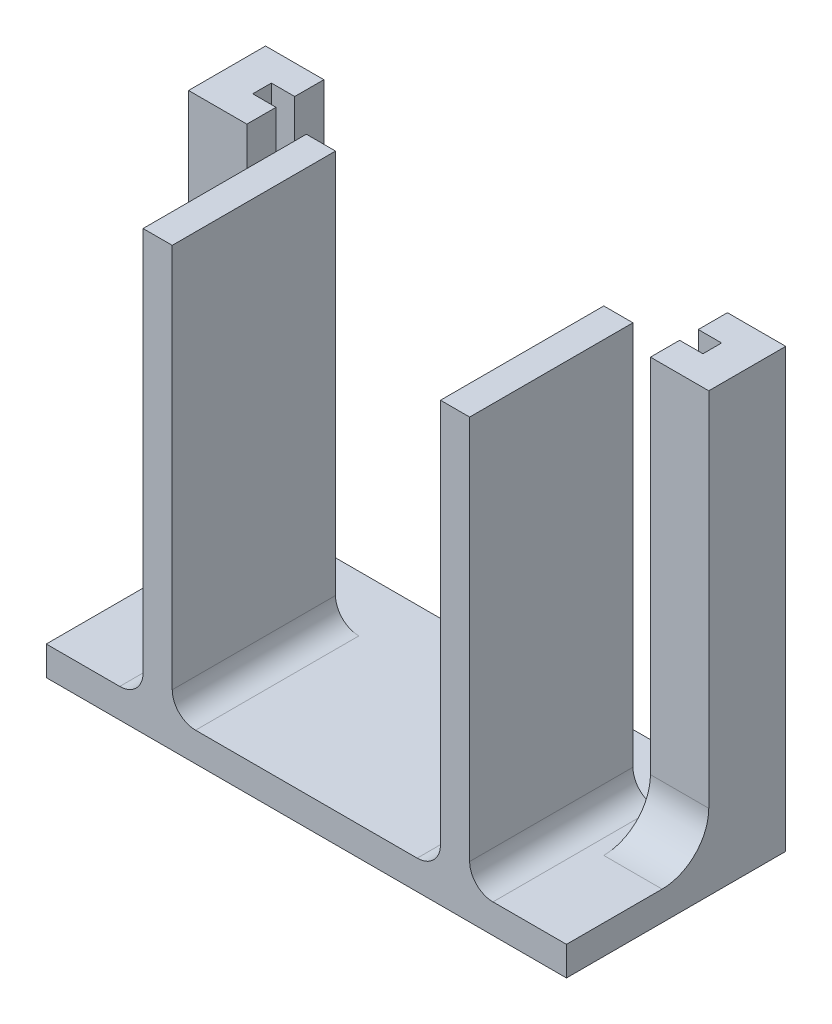
ISO-10303-21;
HEADER;
FILE_DESCRIPTION(('STEP AP214'),'2;1');
FILE_NAME('part.step','',(''),(''),'','','');
FILE_SCHEMA(('AUTOMOTIVE_DESIGN { 1 0 10303 214 1 1 1 1 }'));
ENDSEC;
DATA;
#1=APPLICATION_CONTEXT('core data for automotive mechanical design processes');
#2=APPLICATION_PROTOCOL_DEFINITION('international standard','automotive_design',2000,#1);
#3=PRODUCT_CONTEXT('',#1,'mechanical');
#4=PRODUCT('Part','Part','',(#3));
#5=PRODUCT_RELATED_PRODUCT_CATEGORY('part','',(#4));
#6=PRODUCT_DEFINITION_FORMATION('','',#4);
#7=PRODUCT_DEFINITION_CONTEXT('part definition',#1,'design');
#8=PRODUCT_DEFINITION('design','',#6,#7);
#9=PRODUCT_DEFINITION_SHAPE('','',#8);
#10=(LENGTH_UNIT() NAMED_UNIT(*) SI_UNIT(.MILLI.,.METRE.));
#11=(NAMED_UNIT(*) PLANE_ANGLE_UNIT() SI_UNIT($,.RADIAN.));
#12=(NAMED_UNIT(*) SI_UNIT($,.STERADIAN.) SOLID_ANGLE_UNIT());
#13=UNCERTAINTY_MEASURE_WITH_UNIT(LENGTH_MEASURE(1.E-05),#10,'distance_accuracy_value','');
#14=(GEOMETRIC_REPRESENTATION_CONTEXT(3) GLOBAL_UNCERTAINTY_ASSIGNED_CONTEXT((#13)) GLOBAL_UNIT_ASSIGNED_CONTEXT((#10,
#11,#12)) REPRESENTATION_CONTEXT('',''));
#15=CARTESIAN_POINT('',(0.,0.,0.));
#16=DIRECTION('',(0.,0.,1.));
#17=DIRECTION('',(1.,0.,0.));
#18=AXIS2_PLACEMENT_3D('',#15,#16,#17);
#19=CARTESIAN_POINT('',(-19.3,16.,1.3));
#20=DIRECTION('',(-1.,0.,0.));
#21=DIRECTION('',(0.,0.,1.));
#22=AXIS2_PLACEMENT_3D('',#19,#20,#21);
#23=PLANE('',#22);
#24=DIRECTION('',(0.,0.,-1.));
#25=VECTOR('',#24,1.);
#26=CARTESIAN_POINT('',(-19.3,-19.,1.3));
#27=LINE('',#26,#25);
#28=CARTESIAN_POINT('',(-19.3,-19.,1.3));
#29=VERTEX_POINT('',#28);
#30=CARTESIAN_POINT('',(-19.3,-19.,-0.3));
#31=VERTEX_POINT('',#30);
#32=EDGE_CURVE('E377',#29,#31,#27,.T.);
#33=ORIENTED_EDGE('',*,*,#32,.T.);
#34=DIRECTION('',(0.,-1.,0.));
#35=VECTOR('',#34,1.);
#36=CARTESIAN_POINT('',(-19.3,16.,-0.3));
#37=LINE('',#36,#35);
#38=CARTESIAN_POINT('',(-19.3,16.,-0.3));
#39=VERTEX_POINT('',#38);
#40=EDGE_CURVE('E434',#39,#31,#37,.T.);
#41=ORIENTED_EDGE('',*,*,#40,.F.);
#42=DIRECTION('',(0.,0.,-1.));
#43=VECTOR('',#42,1.);
#44=CARTESIAN_POINT('',(-19.3,16.,1.3));
#45=LINE('',#44,#43);
#46=CARTESIAN_POINT('',(-19.3,16.,1.3));
#47=VERTEX_POINT('',#46);
#48=EDGE_CURVE('E384',#47,#39,#45,.T.);
#49=ORIENTED_EDGE('',*,*,#48,.F.);
#50=DIRECTION('',(0.,-1.,0.));
#51=VECTOR('',#50,1.);
#52=CARTESIAN_POINT('',(-19.3,16.,1.3));
#53=LINE('',#52,#51);
#54=EDGE_CURVE('E401',#47,#29,#53,.T.);
#55=ORIENTED_EDGE('',*,*,#54,.T.);
#56=EDGE_LOOP('',(#33,#41,#49,#55));
#57=FACE_BOUND('',#56,.T.);
#58=ADVANCED_FACE('F39',(#57),#23,.F.);
#59=CARTESIAN_POINT('',(-19.3,16.,-0.3));
#60=DIRECTION('',(0.,0.,-1.));
#61=DIRECTION('',(-1.,0.,0.));
#62=AXIS2_PLACEMENT_3D('',#59,#60,#61);
#63=PLANE('',#62);
#64=DIRECTION('',(1.,0.,0.));
#65=VECTOR('',#64,1.);
#66=CARTESIAN_POINT('',(-19.3,-19.,-0.3));
#67=LINE('',#66,#65);
#68=CARTESIAN_POINT('',(-17.3,-19.,-0.3));
#69=VERTEX_POINT('',#68);
#70=EDGE_CURVE('E409',#31,#69,#67,.T.);
#71=ORIENTED_EDGE('',*,*,#70,.T.);
#72=DIRECTION('',(0.,-1.,0.));
#73=VECTOR('',#72,1.);
#74=CARTESIAN_POINT('',(-17.3,16.,-0.3));
#75=LINE('',#74,#73);
#76=CARTESIAN_POINT('',(-17.3,16.,-0.3));
#77=VERTEX_POINT('',#76);
#78=EDGE_CURVE('E435',#77,#69,#75,.T.);
#79=ORIENTED_EDGE('',*,*,#78,.F.);
#80=DIRECTION('',(1.,0.,0.));
#81=VECTOR('',#80,1.);
#82=CARTESIAN_POINT('',(-19.3,16.,-0.3));
#83=LINE('',#82,#81);
#84=EDGE_CURVE('E389',#39,#77,#83,.T.);
#85=ORIENTED_EDGE('',*,*,#84,.F.);
#86=ORIENTED_EDGE('',*,*,#40,.T.);
#87=EDGE_LOOP('',(#71,#79,#85,#86));
#88=FACE_BOUND('',#87,.T.);
#89=ADVANCED_FACE('F581',(#88),#63,.F.);
#90=CARTESIAN_POINT('',(-17.3,16.,-0.3));
#91=DIRECTION('',(-1.,0.,0.));
#92=DIRECTION('',(0.,0.,1.));
#93=AXIS2_PLACEMENT_3D('',#90,#91,#92);
#94=PLANE('',#93);
#95=DIRECTION('',(0.,0.,-1.));
#96=VECTOR('',#95,1.);
#97=CARTESIAN_POINT('',(-17.3,-19.,-0.3));
#98=LINE('',#97,#96);
#99=CARTESIAN_POINT('',(-17.3,-19.,-2.8));
#100=VERTEX_POINT('',#99);
#101=EDGE_CURVE('E408',#69,#100,#98,.T.);
#102=ORIENTED_EDGE('',*,*,#101,.T.);
#103=DIRECTION('',(0.,-1.,0.));
#104=VECTOR('',#103,1.);
#105=CARTESIAN_POINT('',(-17.3,16.,-2.8));
#106=LINE('',#105,#104);
#107=CARTESIAN_POINT('',(-17.3,16.,-2.8));
#108=VERTEX_POINT('',#107);
#109=EDGE_CURVE('E427',#108,#100,#106,.T.);
#110=ORIENTED_EDGE('',*,*,#109,.F.);
#111=DIRECTION('',(0.,0.,-1.));
#112=VECTOR('',#111,1.);
#113=CARTESIAN_POINT('',(-17.3,16.,-0.3));
#114=LINE('',#113,#112);
#115=EDGE_CURVE('E394',#77,#108,#114,.T.);
#116=ORIENTED_EDGE('',*,*,#115,.F.);
#117=ORIENTED_EDGE('',*,*,#78,.T.);
#118=EDGE_LOOP('',(#102,#110,#116,#117));
#119=FACE_BOUND('',#118,.T.);
#120=ADVANCED_FACE('F577',(#119),#94,.F.);
#121=CARTESIAN_POINT('',(-17.3,16.,-2.8));
#122=DIRECTION('',(0.,0.,1.));
#123=DIRECTION('',(1.,0.,0.));
#124=AXIS2_PLACEMENT_3D('',#121,#122,#123);
#125=PLANE('',#124);
#126=ORIENTED_EDGE('',*,*,#109,.T.);
#127=DIRECTION('',(-1.,0.,0.));
#128=VECTOR('',#127,1.);
#129=CARTESIAN_POINT('',(-22.3,-19.,-2.8));
#130=LINE('',#129,#128);
#131=CARTESIAN_POINT('',(17.3,-19.,-2.8));
#132=VERTEX_POINT('',#131);
#133=EDGE_CURVE('E356',#132,#100,#130,.T.);
#134=ORIENTED_EDGE('',*,*,#133,.F.);
#135=DIRECTION('',(0.,-1.,0.));
#136=VECTOR('',#135,1.);
#137=CARTESIAN_POINT('',(17.3,16.,-2.8));
#138=LINE('',#137,#136);
#139=CARTESIAN_POINT('',(17.3,16.,-2.8));
#140=VERTEX_POINT('',#139);
#141=EDGE_CURVE('E315',#140,#132,#138,.T.);
#142=ORIENTED_EDGE('',*,*,#141,.F.);
#143=DIRECTION('',(-1.,0.,0.));
#144=VECTOR('',#143,1.);
#145=CARTESIAN_POINT('',(17.3,16.,-2.8));
#146=LINE('',#145,#144);
#147=CARTESIAN_POINT('',(22.3,16.,-2.8));
#148=VERTEX_POINT('',#147);
#149=EDGE_CURVE('E341',#148,#140,#146,.T.);
#150=ORIENTED_EDGE('',*,*,#149,.F.);
#151=DIRECTION('',(0.,1.,0.));
#152=VECTOR('',#151,1.);
#153=CARTESIAN_POINT('',(22.3,-21.5,-2.8));
#154=LINE('',#153,#152);
#155=CARTESIAN_POINT('',(22.3,-21.5,-2.8));
#156=VERTEX_POINT('',#155);
#157=EDGE_CURVE('E380',#156,#148,#154,.T.);
#158=ORIENTED_EDGE('',*,*,#157,.F.);
#159=DIRECTION('',(-1.,0.,0.));
#160=VECTOR('',#159,1.);
#161=CARTESIAN_POINT('',(-22.3,-21.5,-2.8));
#162=LINE('',#161,#160);
#163=CARTESIAN_POINT('',(-22.3,-21.5,-2.8));
#164=VERTEX_POINT('',#163);
#165=EDGE_CURVE('E361',#156,#164,#162,.T.);
#166=ORIENTED_EDGE('',*,*,#165,.T.);
#167=DIRECTION('',(0.,-1.,0.));
#168=VECTOR('',#167,1.);
#169=CARTESIAN_POINT('',(-22.3,16.,-2.8));
#170=LINE('',#169,#168);
#171=CARTESIAN_POINT('',(-22.3,16.,-2.8));
#172=VERTEX_POINT('',#171);
#173=EDGE_CURVE('E430',#172,#164,#170,.T.);
#174=ORIENTED_EDGE('',*,*,#173,.F.);
#175=DIRECTION('',(-1.,0.,0.));
#176=VECTOR('',#175,1.);
#177=CARTESIAN_POINT('',(-17.3,16.,-2.8));
#178=LINE('',#177,#176);
#179=EDGE_CURVE('E395',#108,#172,#178,.T.);
#180=ORIENTED_EDGE('',*,*,#179,.F.);
#181=EDGE_LOOP('',(#126,#134,#142,#150,#158,#166,#174,#180));
#182=FACE_BOUND('',#181,.T.);
#183=ADVANCED_FACE('F571',(#182),#125,.F.);
#184=CARTESIAN_POINT('',(-22.3,16.,-2.8));
#185=DIRECTION('',(1.,0.,0.));
#186=DIRECTION('',(0.,0.,-1.));
#187=AXIS2_PLACEMENT_3D('',#184,#185,#186);
#188=PLANE('',#187);
#189=ORIENTED_EDGE('',*,*,#173,.T.);
#190=DIRECTION('',(0.,0.,1.));
#191=VECTOR('',#190,1.);
#192=CARTESIAN_POINT('',(-22.3,-21.5,-2.8));
#193=LINE('',#192,#191);
#194=CARTESIAN_POINT('',(-22.3,-21.5,16.));
#195=VERTEX_POINT('',#194);
#196=EDGE_CURVE('E355',#164,#195,#193,.T.);
#197=ORIENTED_EDGE('',*,*,#196,.T.);
#198=DIRECTION('',(0.,1.,0.));
#199=VECTOR('',#198,1.);
#200=CARTESIAN_POINT('',(-22.3,-21.5,16.));
#201=LINE('',#200,#199);
#202=CARTESIAN_POINT('',(-22.3,-19.,16.));
#203=VERTEX_POINT('',#202);
#204=EDGE_CURVE('E368',#195,#203,#201,.T.);
#205=ORIENTED_EDGE('',*,*,#204,.T.);
#206=DIRECTION('',(0.,0.,1.));
#207=VECTOR('',#206,1.);
#208=CARTESIAN_POINT('',(-22.3,-19.,-2.8));
#209=LINE('',#208,#207);
#210=CARTESIAN_POINT('',(-22.3,-19.,7.8));
#211=VERTEX_POINT('',#210);
#212=EDGE_CURVE('E339',#211,#203,#209,.T.);
#213=ORIENTED_EDGE('',*,*,#212,.F.);
#214=CARTESIAN_POINT('',(-22.3,-15.,7.8));
#215=DIRECTION('',(1.,0.,0.));
#216=DIRECTION('',(0.,0.,-1.));
#217=AXIS2_PLACEMENT_3D('',#214,#215,#216);
#218=CIRCLE('',#217,4.);
#219=CARTESIAN_POINT('',(-22.3,-15.,3.8));
#220=VERTEX_POINT('',#219);
#221=EDGE_CURVE('E11',#211,#220,#218,.T.);
#222=ORIENTED_EDGE('',*,*,#221,.T.);
#223=DIRECTION('',(0.,-1.,0.));
#224=VECTOR('',#223,1.);
#225=CARTESIAN_POINT('',(-22.3,16.,3.8));
#226=LINE('',#225,#224);
#227=CARTESIAN_POINT('',(-22.3,16.,3.8));
#228=VERTEX_POINT('',#227);
#229=EDGE_CURVE('E422',#228,#220,#226,.T.);
#230=ORIENTED_EDGE('',*,*,#229,.F.);
#231=DIRECTION('',(0.,0.,1.));
#232=VECTOR('',#231,1.);
#233=CARTESIAN_POINT('',(-22.3,16.,-2.8));
#234=LINE('',#233,#232);
#235=EDGE_CURVE('E392',#172,#228,#234,.T.);
#236=ORIENTED_EDGE('',*,*,#235,.F.);
#237=EDGE_LOOP('',(#189,#197,#205,#213,#222,#230,#236));
#238=FACE_BOUND('',#237,.T.);
#239=ADVANCED_FACE('F494',(#238),#188,.F.);
#240=CARTESIAN_POINT('',(-22.3,16.,3.8));
#241=DIRECTION('',(0.,0.,-1.));
#242=DIRECTION('',(-1.,0.,0.));
#243=AXIS2_PLACEMENT_3D('',#240,#241,#242);
#244=PLANE('',#243);
#245=ORIENTED_EDGE('',*,*,#229,.T.);
#246=DIRECTION('',(1.,0.,0.));
#247=VECTOR('',#246,1.);
#248=CARTESIAN_POINT('',(-22.3,-15.,3.8));
#249=LINE('',#248,#247);
#250=CARTESIAN_POINT('',(-17.3,-15.,3.8));
#251=VERTEX_POINT('',#250);
#252=EDGE_CURVE('E483',#220,#251,#249,.T.);
#253=ORIENTED_EDGE('',*,*,#252,.T.);
#254=DIRECTION('',(0.,-1.,0.));
#255=VECTOR('',#254,1.);
#256=CARTESIAN_POINT('',(-17.3,16.,3.8));
#257=LINE('',#256,#255);
#258=CARTESIAN_POINT('',(-17.3,16.,3.8));
#259=VERTEX_POINT('',#258);
#260=EDGE_CURVE('E425',#259,#251,#257,.T.);
#261=ORIENTED_EDGE('',*,*,#260,.F.);
#262=DIRECTION('',(1.,0.,0.));
#263=VECTOR('',#262,1.);
#264=CARTESIAN_POINT('',(-22.3,16.,3.8));
#265=LINE('',#264,#263);
#266=EDGE_CURVE('E396',#228,#259,#265,.T.);
#267=ORIENTED_EDGE('',*,*,#266,.F.);
#268=EDGE_LOOP('',(#245,#253,#261,#267));
#269=FACE_BOUND('',#268,.T.);
#270=ADVANCED_FACE('F596',(#269),#244,.F.);
#271=CARTESIAN_POINT('',(-17.3,16.,3.8));
#272=DIRECTION('',(-1.,0.,0.));
#273=DIRECTION('',(0.,0.,1.));
#274=AXIS2_PLACEMENT_3D('',#271,#272,#273);
#275=PLANE('',#274);
#276=DIRECTION('',(0.,0.,-1.));
#277=VECTOR('',#276,1.);
#278=CARTESIAN_POINT('',(-17.3,-19.,3.8));
#279=LINE('',#278,#277);
#280=CARTESIAN_POINT('',(-17.3,-19.,7.8));
#281=VERTEX_POINT('',#280);
#282=CARTESIAN_POINT('',(-17.3,-19.,1.3));
#283=VERTEX_POINT('',#282);
#284=EDGE_CURVE('E411',#281,#283,#279,.T.);
#285=ORIENTED_EDGE('',*,*,#284,.T.);
#286=DIRECTION('',(0.,-1.,0.));
#287=VECTOR('',#286,1.);
#288=CARTESIAN_POINT('',(-17.3,16.,1.3));
#289=LINE('',#288,#287);
#290=CARTESIAN_POINT('',(-17.3,16.,1.3));
#291=VERTEX_POINT('',#290);
#292=EDGE_CURVE('E420',#291,#283,#289,.T.);
#293=ORIENTED_EDGE('',*,*,#292,.F.);
#294=DIRECTION('',(0.,0.,-1.));
#295=VECTOR('',#294,1.);
#296=CARTESIAN_POINT('',(-17.3,16.,3.8));
#297=LINE('',#296,#295);
#298=EDGE_CURVE('E398',#259,#291,#297,.T.);
#299=ORIENTED_EDGE('',*,*,#298,.F.);
#300=ORIENTED_EDGE('',*,*,#260,.T.);
#301=CARTESIAN_POINT('',(-17.3,-15.,7.8));
#302=DIRECTION('',(-1.,0.,0.));
#303=DIRECTION('',(0.,0.,1.));
#304=AXIS2_PLACEMENT_3D('',#301,#302,#303);
#305=CIRCLE('',#304,4.);
#306=EDGE_CURVE('E50',#251,#281,#305,.T.);
#307=ORIENTED_EDGE('',*,*,#306,.T.);
#308=EDGE_LOOP('',(#285,#293,#299,#300,#307));
#309=FACE_BOUND('',#308,.T.);
#310=ADVANCED_FACE('F487',(#309),#275,.F.);
#311=CARTESIAN_POINT('',(-17.3,16.,1.3));
#312=DIRECTION('',(0.,0.,1.));
#313=DIRECTION('',(1.,0.,0.));
#314=AXIS2_PLACEMENT_3D('',#311,#312,#313);
#315=PLANE('',#314);
#316=DIRECTION('',(-1.,0.,0.));
#317=VECTOR('',#316,1.);
#318=CARTESIAN_POINT('',(-17.3,-19.,1.3));
#319=LINE('',#318,#317);
#320=EDGE_CURVE('E386',#283,#29,#319,.T.);
#321=ORIENTED_EDGE('',*,*,#320,.T.);
#322=ORIENTED_EDGE('',*,*,#54,.F.);
#323=DIRECTION('',(-1.,0.,0.));
#324=VECTOR('',#323,1.);
#325=CARTESIAN_POINT('',(-17.3,16.,1.3));
#326=LINE('',#325,#324);
#327=EDGE_CURVE('E402',#291,#47,#326,.T.);
#328=ORIENTED_EDGE('',*,*,#327,.F.);
#329=ORIENTED_EDGE('',*,*,#292,.T.);
#330=EDGE_LOOP('',(#321,#322,#328,#329));
#331=FACE_BOUND('',#330,.T.);
#332=ADVANCED_FACE('F589',(#331),#315,.F.);
#333=CARTESIAN_POINT('',(0.,16.,0.));
#334=DIRECTION('',(0.,-1.,0.));
#335=DIRECTION('',(0.,0.,-1.));
#336=AXIS2_PLACEMENT_3D('',#333,#334,#335);
#337=PLANE('',#336);
#338=ORIENTED_EDGE('',*,*,#48,.T.);
#339=ORIENTED_EDGE('',*,*,#84,.T.);
#340=ORIENTED_EDGE('',*,*,#115,.T.);
#341=ORIENTED_EDGE('',*,*,#179,.T.);
#342=ORIENTED_EDGE('',*,*,#235,.T.);
#343=ORIENTED_EDGE('',*,*,#266,.T.);
#344=ORIENTED_EDGE('',*,*,#298,.T.);
#345=ORIENTED_EDGE('',*,*,#327,.T.);
#346=EDGE_LOOP('',(#338,#339,#340,#341,#342,#343,#344,#345));
#347=FACE_BOUND('',#346,.T.);
#348=ADVANCED_FACE('F595',(#347),#337,.F.);
#349=CARTESIAN_POINT('',(0.,-19.,0.));
#350=DIRECTION('',(0.,1.,0.));
#351=DIRECTION('',(0.,0.,1.));
#352=AXIS2_PLACEMENT_3D('',#349,#350,#351);
#353=PLANE('',#352);
#354=DIRECTION('',(0.,0.,-1.));
#355=VECTOR('',#354,1.);
#356=CARTESIAN_POINT('',(22.3,-19.,-2.8));
#357=LINE('',#356,#355);
#358=CARTESIAN_POINT('',(22.3,-19.,16.));
#359=VERTEX_POINT('',#358);
#360=CARTESIAN_POINT('',(22.3,-19.,7.8));
#361=VERTEX_POINT('',#360);
#362=EDGE_CURVE('E375',#359,#361,#357,.T.);
#363=ORIENTED_EDGE('',*,*,#362,.T.);
#364=DIRECTION('',(1.,0.,0.));
#365=VECTOR('',#364,1.);
#366=CARTESIAN_POINT('',(0.,-19.,7.8));
#367=LINE('',#366,#365);
#368=CARTESIAN_POINT('',(17.3,-19.,7.8));
#369=VERTEX_POINT('',#368);
#370=EDGE_CURVE('E477',#361,#369,#367,.F.);
#371=ORIENTED_EDGE('',*,*,#370,.T.);
#372=DIRECTION('',(0.,0.,1.));
#373=VECTOR('',#372,1.);
#374=CARTESIAN_POINT('',(17.3,-19.,3.8));
#375=LINE('',#374,#373);
#376=CARTESIAN_POINT('',(17.3,-19.,1.3));
#377=VERTEX_POINT('',#376);
#378=EDGE_CURVE('E332',#377,#369,#375,.T.);
#379=ORIENTED_EDGE('',*,*,#378,.F.);
#380=DIRECTION('',(-1.,0.,0.));
#381=VECTOR('',#380,1.);
#382=CARTESIAN_POINT('',(17.3,-19.,1.3));
#383=LINE('',#382,#381);
#384=CARTESIAN_POINT('',(19.3,-19.,1.3));
#385=VERTEX_POINT('',#384);
#386=EDGE_CURVE('E334',#385,#377,#383,.T.);
#387=ORIENTED_EDGE('',*,*,#386,.F.);
#388=DIRECTION('',(0.,0.,1.));
#389=VECTOR('',#388,1.);
#390=CARTESIAN_POINT('',(19.3,-19.,1.3));
#391=LINE('',#390,#389);
#392=CARTESIAN_POINT('',(19.3,-19.,-0.3));
#393=VERTEX_POINT('',#392);
#394=EDGE_CURVE('E323',#393,#385,#391,.T.);
#395=ORIENTED_EDGE('',*,*,#394,.F.);
#396=DIRECTION('',(1.,0.,0.));
#397=VECTOR('',#396,1.);
#398=CARTESIAN_POINT('',(19.3,-19.,-0.3));
#399=LINE('',#398,#397);
#400=CARTESIAN_POINT('',(17.3,-19.,-0.3));
#401=VERTEX_POINT('',#400);
#402=EDGE_CURVE('E324',#401,#393,#399,.T.);
#403=ORIENTED_EDGE('',*,*,#402,.F.);
#404=DIRECTION('',(0.,0.,1.));
#405=VECTOR('',#404,1.);
#406=CARTESIAN_POINT('',(17.3,-19.,-0.3));
#407=LINE('',#406,#405);
#408=EDGE_CURVE('E328',#132,#401,#407,.T.);
#409=ORIENTED_EDGE('',*,*,#408,.F.);
#410=ORIENTED_EDGE('',*,*,#133,.T.);
#411=ORIENTED_EDGE('',*,*,#101,.F.);
#412=ORIENTED_EDGE('',*,*,#70,.F.);
#413=ORIENTED_EDGE('',*,*,#32,.F.);
#414=ORIENTED_EDGE('',*,*,#320,.F.);
#415=ORIENTED_EDGE('',*,*,#284,.F.);
#416=DIRECTION('',(1.,0.,0.));
#417=VECTOR('',#416,1.);
#418=CARTESIAN_POINT('',(0.,-19.,7.8));
#419=LINE('',#418,#417);
#420=EDGE_CURVE('E476',#281,#211,#419,.F.);
#421=ORIENTED_EDGE('',*,*,#420,.T.);
#422=ORIENTED_EDGE('',*,*,#212,.T.);
#423=DIRECTION('',(1.,0.,0.));
#424=VECTOR('',#423,1.);
#425=CARTESIAN_POINT('',(-22.3,-19.,16.));
#426=LINE('',#425,#424);
#427=CARTESIAN_POINT('',(-16.,-19.,16.));
#428=VERTEX_POINT('',#427);
#429=EDGE_CURVE('E369',#203,#428,#426,.T.);
#430=ORIENTED_EDGE('',*,*,#429,.T.);
#431=DIRECTION('',(0.,0.,1.));
#432=VECTOR('',#431,1.);
#433=CARTESIAN_POINT('',(-16.,-19.,0.));
#434=LINE('',#433,#432);
#435=CARTESIAN_POINT('',(-16.,-19.,2.));
#436=VERTEX_POINT('',#435);
#437=EDGE_CURVE('E450',#428,#436,#434,.F.);
#438=ORIENTED_EDGE('',*,*,#437,.T.);
#439=DIRECTION('',(-1.,0.,0.));
#440=VECTOR('',#439,1.);
#441=CARTESIAN_POINT('',(-14.,-19.,2.));
#442=LINE('',#441,#440);
#443=CARTESIAN_POINT('',(-9.5,-19.,2.));
#444=VERTEX_POINT('',#443);
#445=EDGE_CURVE('E294',#444,#436,#442,.T.);
#446=ORIENTED_EDGE('',*,*,#445,.F.);
#447=DIRECTION('',(0.,0.,-1.));
#448=VECTOR('',#447,1.);
#449=CARTESIAN_POINT('',(-9.5,-19.,0.));
#450=LINE('',#449,#448);
#451=CARTESIAN_POINT('',(-9.5,-19.,16.));
#452=VERTEX_POINT('',#451);
#453=EDGE_CURVE('E444',#444,#452,#450,.F.);
#454=ORIENTED_EDGE('',*,*,#453,.T.);
#455=CARTESIAN_POINT('',(9.5,-19.,16.));
#456=VERTEX_POINT('',#455);
#457=EDGE_CURVE('E373',#452,#456,#426,.T.);
#458=ORIENTED_EDGE('',*,*,#457,.T.);
#459=DIRECTION('',(0.,0.,1.));
#460=VECTOR('',#459,1.);
#461=CARTESIAN_POINT('',(9.5,-19.,0.));
#462=LINE('',#461,#460);
#463=CARTESIAN_POINT('',(9.5,-19.,2.));
#464=VERTEX_POINT('',#463);
#465=EDGE_CURVE('E443',#456,#464,#462,.F.);
#466=ORIENTED_EDGE('',*,*,#465,.T.);
#467=DIRECTION('',(-1.,0.,0.));
#468=VECTOR('',#467,1.);
#469=CARTESIAN_POINT('',(14.,-19.,2.));
#470=LINE('',#469,#468);
#471=CARTESIAN_POINT('',(16.,-19.,2.));
#472=VERTEX_POINT('',#471);
#473=EDGE_CURVE('E273',#472,#464,#470,.T.);
#474=ORIENTED_EDGE('',*,*,#473,.F.);
#475=DIRECTION('',(0.,0.,-1.));
#476=VECTOR('',#475,1.);
#477=CARTESIAN_POINT('',(16.,-19.,0.));
#478=LINE('',#477,#476);
#479=CARTESIAN_POINT('',(16.,-19.,16.));
#480=VERTEX_POINT('',#479);
#481=EDGE_CURVE('E442',#472,#480,#478,.F.);
#482=ORIENTED_EDGE('',*,*,#481,.T.);
#483=EDGE_CURVE('E366',#480,#359,#426,.T.);
#484=ORIENTED_EDGE('',*,*,#483,.T.);
#485=EDGE_LOOP('',(#363,#371,#379,#387,#395,#403,#409,#410,#411,#412,#413,#414,#415,#421,#422,
#430,#438,#446,#454,#458,#466,#474,#482,#484));
#486=FACE_BOUND('',#485,.T.);
#487=ADVANCED_FACE('F493',(#486),#353,.T.);
#488=CARTESIAN_POINT('',(22.3,-21.5,-2.8));
#489=DIRECTION('',(1.,0.,0.));
#490=DIRECTION('',(0.,0.,-1.));
#491=AXIS2_PLACEMENT_3D('',#488,#489,#490);
#492=PLANE('',#491);
#493=ORIENTED_EDGE('',*,*,#362,.F.);
#494=DIRECTION('',(0.,1.,0.));
#495=VECTOR('',#494,1.);
#496=CARTESIAN_POINT('',(22.3,-21.5,16.));
#497=LINE('',#496,#495);
#498=CARTESIAN_POINT('',(22.3,-21.5,16.));
#499=VERTEX_POINT('',#498);
#500=EDGE_CURVE('E379',#499,#359,#497,.T.);
#501=ORIENTED_EDGE('',*,*,#500,.F.);
#502=DIRECTION('',(0.,0.,-1.));
#503=VECTOR('',#502,1.);
#504=CARTESIAN_POINT('',(22.3,-21.5,-2.8));
#505=LINE('',#504,#503);
#506=EDGE_CURVE('E357',#499,#156,#505,.T.);
#507=ORIENTED_EDGE('',*,*,#506,.T.);
#508=ORIENTED_EDGE('',*,*,#157,.T.);
#509=DIRECTION('',(0.,0.,-1.));
#510=VECTOR('',#509,1.);
#511=CARTESIAN_POINT('',(22.3,16.,-2.8));
#512=LINE('',#511,#510);
#513=CARTESIAN_POINT('',(22.3,16.,3.8));
#514=VERTEX_POINT('',#513);
#515=EDGE_CURVE('E343',#514,#148,#512,.T.);
#516=ORIENTED_EDGE('',*,*,#515,.F.);
#517=DIRECTION('',(0.,-1.,0.));
#518=VECTOR('',#517,1.);
#519=CARTESIAN_POINT('',(22.3,16.,3.8));
#520=LINE('',#519,#518);
#521=CARTESIAN_POINT('',(22.3,-15.,3.8));
#522=VERTEX_POINT('',#521);
#523=EDGE_CURVE('E310',#514,#522,#520,.T.);
#524=ORIENTED_EDGE('',*,*,#523,.T.);
#525=CARTESIAN_POINT('',(22.3,-15.,7.8));
#526=DIRECTION('',(1.,0.,0.));
#527=DIRECTION('',(0.,0.,-1.));
#528=AXIS2_PLACEMENT_3D('',#525,#526,#527);
#529=CIRCLE('',#528,4.);
#530=EDGE_CURVE('E484',#522,#361,#529,.F.);
#531=ORIENTED_EDGE('',*,*,#530,.T.);
#532=EDGE_LOOP('',(#493,#501,#507,#508,#516,#524,#531));
#533=FACE_BOUND('',#532,.T.);
#534=ADVANCED_FACE('F540',(#533),#492,.T.);
#535=CARTESIAN_POINT('',(-22.3,-21.5,16.));
#536=DIRECTION('',(0.,0.,1.));
#537=DIRECTION('',(1.,0.,0.));
#538=AXIS2_PLACEMENT_3D('',#535,#536,#537);
#539=PLANE('',#538);
#540=ORIENTED_EDGE('',*,*,#429,.F.);
#541=ORIENTED_EDGE('',*,*,#204,.F.);
#542=DIRECTION('',(1.,0.,0.));
#543=VECTOR('',#542,1.);
#544=CARTESIAN_POINT('',(-22.3,-21.5,16.));
#545=LINE('',#544,#543);
#546=EDGE_CURVE('E359',#195,#499,#545,.T.);
#547=ORIENTED_EDGE('',*,*,#546,.T.);
#548=ORIENTED_EDGE('',*,*,#500,.T.);
#549=ORIENTED_EDGE('',*,*,#483,.F.);
#550=CARTESIAN_POINT('',(16.,-17.,16.));
#551=DIRECTION('',(0.,0.,1.));
#552=DIRECTION('',(1.,0.,0.));
#553=AXIS2_PLACEMENT_3D('',#550,#551,#552);
#554=CIRCLE('',#553,2.);
#555=CARTESIAN_POINT('',(14.,-17.,16.));
#556=VERTEX_POINT('',#555);
#557=EDGE_CURVE('E471',#480,#556,#554,.F.);
#558=ORIENTED_EDGE('',*,*,#557,.T.);
#559=DIRECTION('',(0.,-1.,0.));
#560=VECTOR('',#559,1.);
#561=CARTESIAN_POINT('',(14.,16.,16.));
#562=LINE('',#561,#560);
#563=CARTESIAN_POINT('',(14.,16.,16.));
#564=VERTEX_POINT('',#563);
#565=EDGE_CURVE('E267',#564,#556,#562,.T.);
#566=ORIENTED_EDGE('',*,*,#565,.F.);
#567=DIRECTION('',(1.,0.,0.));
#568=VECTOR('',#567,1.);
#569=CARTESIAN_POINT('',(14.,16.,16.));
#570=LINE('',#569,#568);
#571=CARTESIAN_POINT('',(11.5,16.,16.));
#572=VERTEX_POINT('',#571);
#573=EDGE_CURVE('E258',#572,#564,#570,.T.);
#574=ORIENTED_EDGE('',*,*,#573,.F.);
#575=DIRECTION('',(0.,-1.,0.));
#576=VECTOR('',#575,1.);
#577=CARTESIAN_POINT('',(11.5,16.,16.));
#578=LINE('',#577,#576);
#579=CARTESIAN_POINT('',(11.5,-17.,16.));
#580=VERTEX_POINT('',#579);
#581=EDGE_CURVE('E866',#572,#580,#578,.T.);
#582=ORIENTED_EDGE('',*,*,#581,.T.);
#583=CARTESIAN_POINT('',(9.5,-17.,16.));
#584=DIRECTION('',(0.,0.,1.));
#585=DIRECTION('',(1.,0.,0.));
#586=AXIS2_PLACEMENT_3D('',#583,#584,#585);
#587=CIRCLE('',#586,2.);
#588=EDGE_CURVE('E461',#580,#456,#587,.F.);
#589=ORIENTED_EDGE('',*,*,#588,.T.);
#590=ORIENTED_EDGE('',*,*,#457,.F.);
#591=CARTESIAN_POINT('',(-9.5,-17.,16.));
#592=DIRECTION('',(0.,0.,1.));
#593=DIRECTION('',(1.,0.,0.));
#594=AXIS2_PLACEMENT_3D('',#591,#592,#593);
#595=CIRCLE('',#594,2.);
#596=CARTESIAN_POINT('',(-11.5,-17.,16.));
#597=VERTEX_POINT('',#596);
#598=EDGE_CURVE('E468',#452,#597,#595,.F.);
#599=ORIENTED_EDGE('',*,*,#598,.T.);
#600=DIRECTION('',(0.,-1.,0.));
#601=VECTOR('',#600,1.);
#602=CARTESIAN_POINT('',(-11.5,16.,16.));
#603=LINE('',#602,#601);
#604=CARTESIAN_POINT('',(-11.5,16.,16.));
#605=VERTEX_POINT('',#604);
#606=EDGE_CURVE('E283',#605,#597,#603,.T.);
#607=ORIENTED_EDGE('',*,*,#606,.F.);
#608=DIRECTION('',(1.,0.,0.));
#609=VECTOR('',#608,1.);
#610=CARTESIAN_POINT('',(-14.,16.,16.));
#611=LINE('',#610,#609);
#612=CARTESIAN_POINT('',(-14.,16.,16.));
#613=VERTEX_POINT('',#612);
#614=EDGE_CURVE('E304',#613,#605,#611,.T.);
#615=ORIENTED_EDGE('',*,*,#614,.F.);
#616=DIRECTION('',(0.,-1.,0.));
#617=VECTOR('',#616,1.);
#618=CARTESIAN_POINT('',(-14.,16.,16.));
#619=LINE('',#618,#617);
#620=CARTESIAN_POINT('',(-14.,-17.,16.));
#621=VERTEX_POINT('',#620);
#622=EDGE_CURVE('E280',#613,#621,#619,.T.);
#623=ORIENTED_EDGE('',*,*,#622,.T.);
#624=CARTESIAN_POINT('',(-16.,-17.,16.));
#625=DIRECTION('',(0.,0.,1.));
#626=DIRECTION('',(1.,0.,0.));
#627=AXIS2_PLACEMENT_3D('',#624,#625,#626);
#628=CIRCLE('',#627,2.);
#629=EDGE_CURVE('E456',#621,#428,#628,.F.);
#630=ORIENTED_EDGE('',*,*,#629,.T.);
#631=EDGE_LOOP('',(#540,#541,#547,#548,#549,#558,#566,#574,#582,#589,#590,#599,#607,#615,#623,#630));
#632=FACE_BOUND('',#631,.T.);
#633=ADVANCED_FACE('F498',(#632),#539,.T.);
#634=CARTESIAN_POINT('',(0.,-21.5,0.));
#635=DIRECTION('',(0.,1.,0.));
#636=DIRECTION('',(0.,0.,1.));
#637=AXIS2_PLACEMENT_3D('',#634,#635,#636);
#638=PLANE('',#637);
#639=ORIENTED_EDGE('',*,*,#196,.F.);
#640=ORIENTED_EDGE('',*,*,#165,.F.);
#641=ORIENTED_EDGE('',*,*,#506,.F.);
#642=ORIENTED_EDGE('',*,*,#546,.F.);
#643=EDGE_LOOP('',(#639,#640,#641,#642));
#644=FACE_BOUND('',#643,.T.);
#645=ADVANCED_FACE('F597',(#644),#638,.F.);
#646=CARTESIAN_POINT('',(17.3,16.,1.3));
#647=DIRECTION('',(0.,0.,1.));
#648=DIRECTION('',(1.,0.,0.));
#649=AXIS2_PLACEMENT_3D('',#646,#647,#648);
#650=PLANE('',#649);
#651=ORIENTED_EDGE('',*,*,#386,.T.);
#652=DIRECTION('',(0.,-1.,0.));
#653=VECTOR('',#652,1.);
#654=CARTESIAN_POINT('',(17.3,16.,1.3));
#655=LINE('',#654,#653);
#656=CARTESIAN_POINT('',(17.3,16.,1.3));
#657=VERTEX_POINT('',#656);
#658=EDGE_CURVE('E299',#657,#377,#655,.T.);
#659=ORIENTED_EDGE('',*,*,#658,.F.);
#660=DIRECTION('',(-1.,0.,0.));
#661=VECTOR('',#660,1.);
#662=CARTESIAN_POINT('',(17.3,16.,1.3));
#663=LINE('',#662,#661);
#664=CARTESIAN_POINT('',(19.3,16.,1.3));
#665=VERTEX_POINT('',#664);
#666=EDGE_CURVE('E326',#665,#657,#663,.T.);
#667=ORIENTED_EDGE('',*,*,#666,.F.);
#668=DIRECTION('',(0.,-1.,0.));
#669=VECTOR('',#668,1.);
#670=CARTESIAN_POINT('',(19.3,16.,1.3));
#671=LINE('',#670,#669);
#672=EDGE_CURVE('E317',#665,#385,#671,.T.);
#673=ORIENTED_EDGE('',*,*,#672,.T.);
#674=EDGE_LOOP('',(#651,#659,#667,#673));
#675=FACE_BOUND('',#674,.T.);
#676=ADVANCED_FACE('F559',(#675),#650,.F.);
#677=CARTESIAN_POINT('',(17.3,16.,3.8));
#678=DIRECTION('',(1.,0.,0.));
#679=DIRECTION('',(0.,0.,-1.));
#680=AXIS2_PLACEMENT_3D('',#677,#678,#679);
#681=PLANE('',#680);
#682=ORIENTED_EDGE('',*,*,#378,.T.);
#683=CARTESIAN_POINT('',(17.3,-15.,7.8));
#684=DIRECTION('',(1.,0.,0.));
#685=DIRECTION('',(0.,0.,-1.));
#686=AXIS2_PLACEMENT_3D('',#683,#684,#685);
#687=CIRCLE('',#686,4.);
#688=CARTESIAN_POINT('',(17.3,-15.,3.8));
#689=VERTEX_POINT('',#688);
#690=EDGE_CURVE('E490',#369,#689,#687,.T.);
#691=ORIENTED_EDGE('',*,*,#690,.T.);
#692=DIRECTION('',(0.,-1.,0.));
#693=VECTOR('',#692,1.);
#694=CARTESIAN_POINT('',(17.3,16.,3.8));
#695=LINE('',#694,#693);
#696=CARTESIAN_POINT('',(17.3,16.,3.8));
#697=VERTEX_POINT('',#696);
#698=EDGE_CURVE('E308',#697,#689,#695,.T.);
#699=ORIENTED_EDGE('',*,*,#698,.F.);
#700=DIRECTION('',(0.,0.,1.));
#701=VECTOR('',#700,1.);
#702=CARTESIAN_POINT('',(17.3,16.,3.8));
#703=LINE('',#702,#701);
#704=EDGE_CURVE('E349',#657,#697,#703,.T.);
#705=ORIENTED_EDGE('',*,*,#704,.F.);
#706=ORIENTED_EDGE('',*,*,#658,.T.);
#707=EDGE_LOOP('',(#682,#691,#699,#705,#706));
#708=FACE_BOUND('',#707,.T.);
#709=ADVANCED_FACE('F548',(#708),#681,.F.);
#710=CARTESIAN_POINT('',(22.3,16.,3.8));
#711=DIRECTION('',(0.,0.,-1.));
#712=DIRECTION('',(-1.,0.,0.));
#713=AXIS2_PLACEMENT_3D('',#710,#711,#712);
#714=PLANE('',#713);
#715=ORIENTED_EDGE('',*,*,#698,.T.);
#716=DIRECTION('',(1.,0.,0.));
#717=VECTOR('',#716,1.);
#718=CARTESIAN_POINT('',(22.3,-15.,3.8));
#719=LINE('',#718,#717);
#720=EDGE_CURVE('E474',#689,#522,#719,.T.);
#721=ORIENTED_EDGE('',*,*,#720,.T.);
#722=ORIENTED_EDGE('',*,*,#523,.F.);
#723=DIRECTION('',(1.,0.,0.));
#724=VECTOR('',#723,1.);
#725=CARTESIAN_POINT('',(22.3,16.,3.8));
#726=LINE('',#725,#724);
#727=EDGE_CURVE('E350',#697,#514,#726,.T.);
#728=ORIENTED_EDGE('',*,*,#727,.F.);
#729=EDGE_LOOP('',(#715,#721,#722,#728));
#730=FACE_BOUND('',#729,.T.);
#731=ADVANCED_FACE('F544',(#730),#714,.F.);
#732=CARTESIAN_POINT('',(17.3,16.,-0.3));
#733=DIRECTION('',(1.,0.,0.));
#734=DIRECTION('',(0.,0.,-1.));
#735=AXIS2_PLACEMENT_3D('',#732,#733,#734);
#736=PLANE('',#735);
#737=ORIENTED_EDGE('',*,*,#408,.T.);
#738=DIRECTION('',(0.,-1.,0.));
#739=VECTOR('',#738,1.);
#740=CARTESIAN_POINT('',(17.3,16.,-0.3));
#741=LINE('',#740,#739);
#742=CARTESIAN_POINT('',(17.3,16.,-0.3));
#743=VERTEX_POINT('',#742);
#744=EDGE_CURVE('E314',#743,#401,#741,.T.);
#745=ORIENTED_EDGE('',*,*,#744,.F.);
#746=DIRECTION('',(0.,0.,1.));
#747=VECTOR('',#746,1.);
#748=CARTESIAN_POINT('',(17.3,16.,-0.3));
#749=LINE('',#748,#747);
#750=EDGE_CURVE('E337',#140,#743,#749,.T.);
#751=ORIENTED_EDGE('',*,*,#750,.F.);
#752=ORIENTED_EDGE('',*,*,#141,.T.);
#753=EDGE_LOOP('',(#737,#745,#751,#752));
#754=FACE_BOUND('',#753,.T.);
#755=ADVANCED_FACE('F605',(#754),#736,.F.);
#756=CARTESIAN_POINT('',(19.3,16.,-0.3));
#757=DIRECTION('',(0.,0.,-1.));
#758=DIRECTION('',(-1.,0.,0.));
#759=AXIS2_PLACEMENT_3D('',#756,#757,#758);
#760=PLANE('',#759);
#761=ORIENTED_EDGE('',*,*,#402,.T.);
#762=DIRECTION('',(0.,-1.,0.));
#763=VECTOR('',#762,1.);
#764=CARTESIAN_POINT('',(19.3,16.,-0.3));
#765=LINE('',#764,#763);
#766=CARTESIAN_POINT('',(19.3,16.,-0.3));
#767=VERTEX_POINT('',#766);
#768=EDGE_CURVE('E320',#767,#393,#765,.T.);
#769=ORIENTED_EDGE('',*,*,#768,.F.);
#770=DIRECTION('',(1.,0.,0.));
#771=VECTOR('',#770,1.);
#772=CARTESIAN_POINT('',(19.3,16.,-0.3));
#773=LINE('',#772,#771);
#774=EDGE_CURVE('E340',#743,#767,#773,.T.);
#775=ORIENTED_EDGE('',*,*,#774,.F.);
#776=ORIENTED_EDGE('',*,*,#744,.T.);
#777=EDGE_LOOP('',(#761,#769,#775,#776));
#778=FACE_BOUND('',#777,.T.);
#779=ADVANCED_FACE('F562',(#778),#760,.F.);
#780=CARTESIAN_POINT('',(19.3,16.,1.3));
#781=DIRECTION('',(1.,0.,0.));
#782=DIRECTION('',(0.,0.,-1.));
#783=AXIS2_PLACEMENT_3D('',#780,#781,#782);
#784=PLANE('',#783);
#785=ORIENTED_EDGE('',*,*,#394,.T.);
#786=ORIENTED_EDGE('',*,*,#672,.F.);
#787=DIRECTION('',(0.,0.,1.));
#788=VECTOR('',#787,1.);
#789=CARTESIAN_POINT('',(19.3,16.,1.3));
#790=LINE('',#789,#788);
#791=EDGE_CURVE('E325',#767,#665,#790,.T.);
#792=ORIENTED_EDGE('',*,*,#791,.F.);
#793=ORIENTED_EDGE('',*,*,#768,.T.);
#794=EDGE_LOOP('',(#785,#786,#792,#793));
#795=FACE_BOUND('',#794,.T.);
#796=ADVANCED_FACE('F564',(#795),#784,.F.);
#797=CARTESIAN_POINT('',(0.,16.,0.));
#798=DIRECTION('',(0.,1.,0.));
#799=DIRECTION('',(0.,0.,1.));
#800=AXIS2_PLACEMENT_3D('',#797,#798,#799);
#801=PLANE('',#800);
#802=ORIENTED_EDGE('',*,*,#666,.T.);
#803=ORIENTED_EDGE('',*,*,#704,.T.);
#804=ORIENTED_EDGE('',*,*,#727,.T.);
#805=ORIENTED_EDGE('',*,*,#515,.T.);
#806=ORIENTED_EDGE('',*,*,#149,.T.);
#807=ORIENTED_EDGE('',*,*,#750,.T.);
#808=ORIENTED_EDGE('',*,*,#774,.T.);
#809=ORIENTED_EDGE('',*,*,#791,.T.);
#810=EDGE_LOOP('',(#802,#803,#804,#805,#806,#807,#808,#809));
#811=FACE_BOUND('',#810,.T.);
#812=ADVANCED_FACE('F601',(#811),#801,.T.);
#813=CARTESIAN_POINT('',(-14.,16.,2.));
#814=DIRECTION('',(1.,0.,0.));
#815=DIRECTION('',(0.,0.,-1.));
#816=AXIS2_PLACEMENT_3D('',#813,#814,#815);
#817=PLANE('',#816);
#818=DIRECTION('',(0.,-1.,0.));
#819=VECTOR('',#818,1.);
#820=CARTESIAN_POINT('',(-14.,16.,2.));
#821=LINE('',#820,#819);
#822=CARTESIAN_POINT('',(-14.,16.,2.));
#823=VERTEX_POINT('',#822);
#824=CARTESIAN_POINT('',(-14.,-17.,2.));
#825=VERTEX_POINT('',#824);
#826=EDGE_CURVE('E287',#823,#825,#821,.T.);
#827=ORIENTED_EDGE('',*,*,#826,.T.);
#828=DIRECTION('',(0.,0.,1.));
#829=VECTOR('',#828,1.);
#830=CARTESIAN_POINT('',(-14.,-17.,2.));
#831=LINE('',#830,#829);
#832=EDGE_CURVE('E437',#825,#621,#831,.T.);
#833=ORIENTED_EDGE('',*,*,#832,.T.);
#834=ORIENTED_EDGE('',*,*,#622,.F.);
#835=DIRECTION('',(0.,0.,1.));
#836=VECTOR('',#835,1.);
#837=CARTESIAN_POINT('',(-14.,16.,2.));
#838=LINE('',#837,#836);
#839=EDGE_CURVE('E296',#823,#613,#838,.T.);
#840=ORIENTED_EDGE('',*,*,#839,.F.);
#841=EDGE_LOOP('',(#827,#833,#834,#840));
#842=FACE_BOUND('',#841,.T.);
#843=ADVANCED_FACE('F515',(#842),#817,.F.);
#844=CARTESIAN_POINT('',(-11.5,16.,2.));
#845=DIRECTION('',(-1.,0.,0.));
#846=DIRECTION('',(0.,0.,1.));
#847=AXIS2_PLACEMENT_3D('',#844,#845,#846);
#848=PLANE('',#847);
#849=ORIENTED_EDGE('',*,*,#606,.T.);
#850=DIRECTION('',(0.,0.,-1.));
#851=VECTOR('',#850,1.);
#852=CARTESIAN_POINT('',(-11.5,-17.,2.));
#853=LINE('',#852,#851);
#854=CARTESIAN_POINT('',(-11.5,-17.,2.));
#855=VERTEX_POINT('',#854);
#856=EDGE_CURVE('E453',#597,#855,#853,.T.);
#857=ORIENTED_EDGE('',*,*,#856,.T.);
#858=DIRECTION('',(0.,-1.,0.));
#859=VECTOR('',#858,1.);
#860=CARTESIAN_POINT('',(-11.5,16.,2.));
#861=LINE('',#860,#859);
#862=CARTESIAN_POINT('',(-11.5,16.,2.));
#863=VERTEX_POINT('',#862);
#864=EDGE_CURVE('E286',#863,#855,#861,.T.);
#865=ORIENTED_EDGE('',*,*,#864,.F.);
#866=DIRECTION('',(0.,0.,-1.));
#867=VECTOR('',#866,1.);
#868=CARTESIAN_POINT('',(-11.5,16.,2.));
#869=LINE('',#868,#867);
#870=EDGE_CURVE('E298',#605,#863,#869,.T.);
#871=ORIENTED_EDGE('',*,*,#870,.F.);
#872=EDGE_LOOP('',(#849,#857,#865,#871));
#873=FACE_BOUND('',#872,.T.);
#874=ADVANCED_FACE('F524',(#873),#848,.F.);
#875=CARTESIAN_POINT('',(-14.,16.,2.));
#876=DIRECTION('',(0.,0.,1.));
#877=DIRECTION('',(1.,0.,0.));
#878=AXIS2_PLACEMENT_3D('',#875,#876,#877);
#879=PLANE('',#878);
#880=ORIENTED_EDGE('',*,*,#445,.T.);
#881=CARTESIAN_POINT('',(-16.,-17.,2.));
#882=DIRECTION('',(0.,0.,1.));
#883=DIRECTION('',(1.,0.,0.));
#884=AXIS2_PLACEMENT_3D('',#881,#882,#883);
#885=CIRCLE('',#884,2.);
#886=EDGE_CURVE('E458',#436,#825,#885,.T.);
#887=ORIENTED_EDGE('',*,*,#886,.T.);
#888=ORIENTED_EDGE('',*,*,#826,.F.);
#889=DIRECTION('',(-1.,0.,0.));
#890=VECTOR('',#889,1.);
#891=CARTESIAN_POINT('',(-14.,16.,2.));
#892=LINE('',#891,#890);
#893=EDGE_CURVE('E291',#863,#823,#892,.T.);
#894=ORIENTED_EDGE('',*,*,#893,.F.);
#895=ORIENTED_EDGE('',*,*,#864,.T.);
#896=CARTESIAN_POINT('',(-9.5,-17.,2.));
#897=DIRECTION('',(0.,0.,1.));
#898=DIRECTION('',(1.,0.,0.));
#899=AXIS2_PLACEMENT_3D('',#896,#897,#898);
#900=CIRCLE('',#899,2.);
#901=EDGE_CURVE('E469',#855,#444,#900,.T.);
#902=ORIENTED_EDGE('',*,*,#901,.T.);
#903=EDGE_LOOP('',(#880,#887,#888,#894,#895,#902));
#904=FACE_BOUND('',#903,.T.);
#905=ADVANCED_FACE('F510',(#904),#879,.F.);
#906=CARTESIAN_POINT('',(0.,16.,0.));
#907=DIRECTION('',(0.,1.,0.));
#908=DIRECTION('',(0.,0.,1.));
#909=AXIS2_PLACEMENT_3D('',#906,#907,#908);
#910=PLANE('',#909);
#911=ORIENTED_EDGE('',*,*,#839,.T.);
#912=ORIENTED_EDGE('',*,*,#614,.T.);
#913=ORIENTED_EDGE('',*,*,#870,.T.);
#914=ORIENTED_EDGE('',*,*,#893,.T.);
#915=EDGE_LOOP('',(#911,#912,#913,#914));
#916=FACE_BOUND('',#915,.T.);
#917=ADVANCED_FACE('F513',(#916),#910,.T.);
#918=CARTESIAN_POINT('',(14.,16.,2.));
#919=DIRECTION('',(0.,0.,1.));
#920=DIRECTION('',(1.,0.,0.));
#921=AXIS2_PLACEMENT_3D('',#918,#919,#920);
#922=PLANE('',#921);
#923=ORIENTED_EDGE('',*,*,#473,.T.);
#924=CARTESIAN_POINT('',(9.5,-17.,2.));
#925=DIRECTION('',(0.,0.,1.));
#926=DIRECTION('',(1.,0.,0.));
#927=AXIS2_PLACEMENT_3D('',#924,#925,#926);
#928=CIRCLE('',#927,2.);
#929=CARTESIAN_POINT('',(11.5,-17.,2.));
#930=VERTEX_POINT('',#929);
#931=EDGE_CURVE('E463',#464,#930,#928,.T.);
#932=ORIENTED_EDGE('',*,*,#931,.T.);
#933=DIRECTION('',(0.,-1.,0.));
#934=VECTOR('',#933,1.);
#935=CARTESIAN_POINT('',(11.5,16.,2.));
#936=LINE('',#935,#934);
#937=CARTESIAN_POINT('',(11.5,16.,2.));
#938=VERTEX_POINT('',#937);
#939=EDGE_CURVE('E272',#938,#930,#936,.T.);
#940=ORIENTED_EDGE('',*,*,#939,.F.);
#941=DIRECTION('',(-1.,0.,0.));
#942=VECTOR('',#941,1.);
#943=CARTESIAN_POINT('',(14.,16.,2.));
#944=LINE('',#943,#942);
#945=CARTESIAN_POINT('',(14.,16.,2.));
#946=VERTEX_POINT('',#945);
#947=EDGE_CURVE('E251',#946,#938,#944,.T.);
#948=ORIENTED_EDGE('',*,*,#947,.F.);
#949=DIRECTION('',(0.,-1.,0.));
#950=VECTOR('',#949,1.);
#951=CARTESIAN_POINT('',(14.,16.,2.));
#952=LINE('',#951,#950);
#953=CARTESIAN_POINT('',(14.,-17.,2.));
#954=VERTEX_POINT('',#953);
#955=EDGE_CURVE('E257',#946,#954,#952,.T.);
#956=ORIENTED_EDGE('',*,*,#955,.T.);
#957=CARTESIAN_POINT('',(16.,-17.,2.));
#958=DIRECTION('',(0.,0.,1.));
#959=DIRECTION('',(1.,0.,0.));
#960=AXIS2_PLACEMENT_3D('',#957,#958,#959);
#961=CIRCLE('',#960,2.);
#962=EDGE_CURVE('E473',#954,#472,#961,.T.);
#963=ORIENTED_EDGE('',*,*,#962,.T.);
#964=EDGE_LOOP('',(#923,#932,#940,#948,#956,#963));
#965=FACE_BOUND('',#964,.T.);
#966=ADVANCED_FACE('F271',(#965),#922,.F.);
#967=CARTESIAN_POINT('',(11.5,16.,2.));
#968=DIRECTION('',(1.,0.,0.));
#969=DIRECTION('',(0.,0.,-1.));
#970=AXIS2_PLACEMENT_3D('',#967,#968,#969);
#971=PLANE('',#970);
#972=ORIENTED_EDGE('',*,*,#939,.T.);
#973=DIRECTION('',(0.,0.,1.));
#974=VECTOR('',#973,1.);
#975=CARTESIAN_POINT('',(11.5,-17.,2.));
#976=LINE('',#975,#974);
#977=EDGE_CURVE('E454',#930,#580,#976,.T.);
#978=ORIENTED_EDGE('',*,*,#977,.T.);
#979=ORIENTED_EDGE('',*,*,#581,.F.);
#980=DIRECTION('',(0.,0.,1.));
#981=VECTOR('',#980,1.);
#982=CARTESIAN_POINT('',(11.5,16.,2.));
#983=LINE('',#982,#981);
#984=EDGE_CURVE('E274',#938,#572,#983,.T.);
#985=ORIENTED_EDGE('',*,*,#984,.F.);
#986=EDGE_LOOP('',(#972,#978,#979,#985));
#987=FACE_BOUND('',#986,.T.);
#988=ADVANCED_FACE('F838',(#987),#971,.F.);
#989=CARTESIAN_POINT('',(14.,16.,2.));
#990=DIRECTION('',(-1.,0.,0.));
#991=DIRECTION('',(0.,0.,1.));
#992=AXIS2_PLACEMENT_3D('',#989,#990,#991);
#993=PLANE('',#992);
#994=ORIENTED_EDGE('',*,*,#565,.T.);
#995=DIRECTION('',(0.,0.,-1.));
#996=VECTOR('',#995,1.);
#997=CARTESIAN_POINT('',(14.,-17.,2.));
#998=LINE('',#997,#996);
#999=EDGE_CURVE('E266',#556,#954,#998,.T.);
#1000=ORIENTED_EDGE('',*,*,#999,.T.);
#1001=ORIENTED_EDGE('',*,*,#955,.F.);
#1002=DIRECTION('',(0.,0.,-1.));
#1003=VECTOR('',#1002,1.);
#1004=CARTESIAN_POINT('',(14.,16.,2.));
#1005=LINE('',#1004,#1003);
#1006=EDGE_CURVE('E248',#564,#946,#1005,.T.);
#1007=ORIENTED_EDGE('',*,*,#1006,.F.);
#1008=EDGE_LOOP('',(#994,#1000,#1001,#1007));
#1009=FACE_BOUND('',#1008,.T.);
#1010=ADVANCED_FACE('F262',(#1009),#993,.F.);
#1011=CARTESIAN_POINT('',(0.,16.,0.));
#1012=DIRECTION('',(0.,1.,0.));
#1013=DIRECTION('',(0.,0.,1.));
#1014=AXIS2_PLACEMENT_3D('',#1011,#1012,#1013);
#1015=PLANE('',#1014);
#1016=ORIENTED_EDGE('',*,*,#947,.T.);
#1017=ORIENTED_EDGE('',*,*,#984,.T.);
#1018=ORIENTED_EDGE('',*,*,#573,.T.);
#1019=ORIENTED_EDGE('',*,*,#1006,.T.);
#1020=EDGE_LOOP('',(#1016,#1017,#1018,#1019));
#1021=FACE_BOUND('',#1020,.T.);
#1022=ADVANCED_FACE('F253',(#1021),#1015,.T.);
#1023=CARTESIAN_POINT('',(-16.,-17.,2.));
#1024=DIRECTION('',(0.,0.,1.));
#1025=DIRECTION('',(1.,0.,0.));
#1026=AXIS2_PLACEMENT_3D('',#1023,#1024,#1025);
#1027=CYLINDRICAL_SURFACE('',#1026,2.);
#1028=ORIENTED_EDGE('',*,*,#886,.F.);
#1029=ORIENTED_EDGE('',*,*,#437,.F.);
#1030=ORIENTED_EDGE('',*,*,#629,.F.);
#1031=ORIENTED_EDGE('',*,*,#832,.F.);
#1032=EDGE_LOOP('',(#1028,#1029,#1030,#1031));
#1033=FACE_BOUND('',#1032,.T.);
#1034=ADVANCED_FACE('F503',(#1033),#1027,.F.);
#1035=CARTESIAN_POINT('',(9.5,-17.,2.));
#1036=DIRECTION('',(0.,0.,1.));
#1037=DIRECTION('',(1.,0.,0.));
#1038=AXIS2_PLACEMENT_3D('',#1035,#1036,#1037);
#1039=CYLINDRICAL_SURFACE('',#1038,2.);
#1040=ORIENTED_EDGE('',*,*,#931,.F.);
#1041=ORIENTED_EDGE('',*,*,#465,.F.);
#1042=ORIENTED_EDGE('',*,*,#588,.F.);
#1043=ORIENTED_EDGE('',*,*,#977,.F.);
#1044=EDGE_LOOP('',(#1040,#1041,#1042,#1043));
#1045=FACE_BOUND('',#1044,.T.);
#1046=ADVANCED_FACE('F621',(#1045),#1039,.F.);
#1047=CARTESIAN_POINT('',(-9.5,-17.,2.));
#1048=DIRECTION('',(0.,0.,-1.));
#1049=DIRECTION('',(-1.,0.,0.));
#1050=AXIS2_PLACEMENT_3D('',#1047,#1048,#1049);
#1051=CYLINDRICAL_SURFACE('',#1050,2.);
#1052=ORIENTED_EDGE('',*,*,#598,.F.);
#1053=ORIENTED_EDGE('',*,*,#453,.F.);
#1054=ORIENTED_EDGE('',*,*,#901,.F.);
#1055=ORIENTED_EDGE('',*,*,#856,.F.);
#1056=EDGE_LOOP('',(#1052,#1053,#1054,#1055));
#1057=FACE_BOUND('',#1056,.T.);
#1058=ADVANCED_FACE('F522',(#1057),#1051,.F.);
#1059=CARTESIAN_POINT('',(16.,-17.,2.));
#1060=DIRECTION('',(0.,0.,-1.));
#1061=DIRECTION('',(-1.,0.,0.));
#1062=AXIS2_PLACEMENT_3D('',#1059,#1060,#1061);
#1063=CYLINDRICAL_SURFACE('',#1062,2.);
#1064=ORIENTED_EDGE('',*,*,#557,.F.);
#1065=ORIENTED_EDGE('',*,*,#481,.F.);
#1066=ORIENTED_EDGE('',*,*,#962,.F.);
#1067=ORIENTED_EDGE('',*,*,#999,.F.);
#1068=EDGE_LOOP('',(#1064,#1065,#1066,#1067));
#1069=FACE_BOUND('',#1068,.T.);
#1070=ADVANCED_FACE('F628',(#1069),#1063,.F.);
#1071=CARTESIAN_POINT('',(22.3,-15.,7.8));
#1072=DIRECTION('',(1.,0.,0.));
#1073=DIRECTION('',(0.,0.,-1.));
#1074=AXIS2_PLACEMENT_3D('',#1071,#1072,#1073);
#1075=CYLINDRICAL_SURFACE('',#1074,4.);
#1076=ORIENTED_EDGE('',*,*,#690,.F.);
#1077=ORIENTED_EDGE('',*,*,#370,.F.);
#1078=ORIENTED_EDGE('',*,*,#530,.F.);
#1079=ORIENTED_EDGE('',*,*,#720,.F.);
#1080=EDGE_LOOP('',(#1076,#1077,#1078,#1079));
#1081=FACE_BOUND('',#1080,.T.);
#1082=ADVANCED_FACE('F543',(#1081),#1075,.F.);
#1083=CARTESIAN_POINT('',(-22.3,-15.,7.8));
#1084=DIRECTION('',(1.,0.,0.));
#1085=DIRECTION('',(0.,0.,-1.));
#1086=AXIS2_PLACEMENT_3D('',#1083,#1084,#1085);
#1087=CYLINDRICAL_SURFACE('',#1086,4.);
#1088=ORIENTED_EDGE('',*,*,#221,.F.);
#1089=ORIENTED_EDGE('',*,*,#420,.F.);
#1090=ORIENTED_EDGE('',*,*,#306,.F.);
#1091=ORIENTED_EDGE('',*,*,#252,.F.);
#1092=EDGE_LOOP('',(#1088,#1089,#1090,#1091));
#1093=FACE_BOUND('',#1092,.T.);
#1094=ADVANCED_FACE('F41',(#1093),#1087,.F.);
#1095=CLOSED_SHELL('',(#58,#89,#120,#183,#239,#270,#310,#332,#348,#487,#534,#633,#645,#676,#709,
#731,#755,#779,#796,#812,#843,#874,#905,#917,#966,#988,#1010,#1022,#1034,#1046,#1058,#1070,
#1082,#1094));
#1096=MANIFOLD_SOLID_BREP('B2',#1095);
#1097=ADVANCED_BREP_SHAPE_REPRESENTATION('',(#18,#1096),#14);
#1098=SHAPE_DEFINITION_REPRESENTATION(#9,#1097);
ENDSEC;
END-ISO-10303-21;
